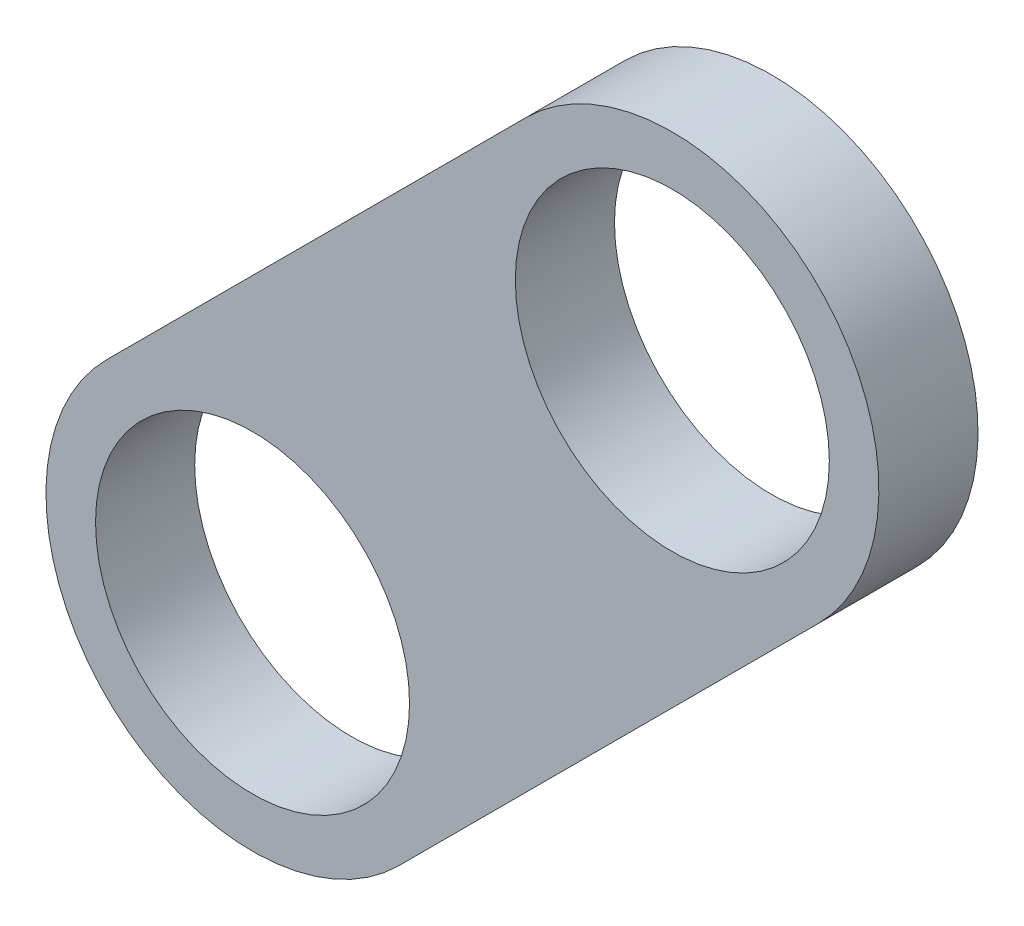
ISO-10303-21;
HEADER;
FILE_DESCRIPTION(('STEP AP214'),'2;1');
FILE_NAME('part.step','',(''),(''),'','','');
FILE_SCHEMA(('AUTOMOTIVE_DESIGN { 1 0 10303 214 1 1 1 1 }'));
ENDSEC;
DATA;
#1=APPLICATION_CONTEXT('core data for automotive mechanical design processes');
#2=APPLICATION_PROTOCOL_DEFINITION('international standard','automotive_design',2000,#1);
#3=PRODUCT_CONTEXT('',#1,'mechanical');
#4=PRODUCT('Part','Part','',(#3));
#5=PRODUCT_RELATED_PRODUCT_CATEGORY('part','',(#4));
#6=PRODUCT_DEFINITION_FORMATION('','',#4);
#7=PRODUCT_DEFINITION_CONTEXT('part definition',#1,'design');
#8=PRODUCT_DEFINITION('design','',#6,#7);
#9=PRODUCT_DEFINITION_SHAPE('','',#8);
#10=(LENGTH_UNIT() NAMED_UNIT(*) SI_UNIT(.MILLI.,.METRE.));
#11=(NAMED_UNIT(*) PLANE_ANGLE_UNIT() SI_UNIT($,.RADIAN.));
#12=(NAMED_UNIT(*) SI_UNIT($,.STERADIAN.) SOLID_ANGLE_UNIT());
#13=UNCERTAINTY_MEASURE_WITH_UNIT(LENGTH_MEASURE(1.E-05),#10,'distance_accuracy_value','');
#14=(GEOMETRIC_REPRESENTATION_CONTEXT(3) GLOBAL_UNCERTAINTY_ASSIGNED_CONTEXT((#13)) GLOBAL_UNIT_ASSIGNED_CONTEXT((#10,
#11,#12)) REPRESENTATION_CONTEXT('',''));
#15=CARTESIAN_POINT('',(0.,0.,0.));
#16=DIRECTION('',(0.,0.,1.));
#17=DIRECTION('',(1.,0.,0.));
#18=AXIS2_PLACEMENT_3D('',#15,#16,#17);
#19=CARTESIAN_POINT('',(0.,0.,6.));
#20=DIRECTION('',(0.,0.,1.));
#21=DIRECTION('',(1.,0.,0.));
#22=AXIS2_PLACEMENT_3D('',#19,#20,#21);
#23=PLANE('',#22);
#24=CARTESIAN_POINT('',(0.,0.,6.));
#25=DIRECTION('',(0.,0.,1.));
#26=DIRECTION('',(1.,0.,0.));
#27=AXIS2_PLACEMENT_3D('',#24,#25,#26);
#28=CIRCLE('',#27,9.5);
#29=CARTESIAN_POINT('',(9.5,0.,6.));
#30=VERTEX_POINT('',#29);
#31=EDGE_CURVE('E112',#30,#30,#28,.T.);
#32=ORIENTED_EDGE('',*,*,#31,.F.);
#33=EDGE_LOOP('',(#32));
#34=FACE_BOUND('',#33,.T.);
#35=CARTESIAN_POINT('',(0.,0.,6.));
#36=DIRECTION('',(0.,0.,1.));
#37=DIRECTION('',(1.,0.,0.));
#38=AXIS2_PLACEMENT_3D('',#35,#36,#37);
#39=CIRCLE('',#38,12.5);
#40=CARTESIAN_POINT('',(-8.83883476483185,8.83883476483185,6.));
#41=VERTEX_POINT('',#40);
#42=CARTESIAN_POINT('',(8.83883476483184,-8.83883476483184,6.));
#43=VERTEX_POINT('',#42);
#44=EDGE_CURVE('E92',#41,#43,#39,.T.);
#45=ORIENTED_EDGE('',*,*,#44,.T.);
#46=DIRECTION('',(0.707106781186548,0.707106781186548,0.));
#47=VECTOR('',#46,1.);
#48=CARTESIAN_POINT('',(8.83883476483184,-8.83883476483184,6.));
#49=LINE('',#48,#47);
#50=CARTESIAN_POINT('',(34.2388347648318,16.5611652351681,6.));
#51=VERTEX_POINT('',#50);
#52=EDGE_CURVE('E87',#43,#51,#49,.T.);
#53=ORIENTED_EDGE('',*,*,#52,.T.);
#54=CARTESIAN_POINT('',(25.4,25.4,6.));
#55=DIRECTION('',(0.,0.,1.));
#56=DIRECTION('',(1.,0.,0.));
#57=AXIS2_PLACEMENT_3D('',#54,#55,#56);
#58=CIRCLE('',#57,12.5);
#59=CARTESIAN_POINT('',(16.5611652351682,34.2388347648318,6.));
#60=VERTEX_POINT('',#59);
#61=EDGE_CURVE('E90',#51,#60,#58,.T.);
#62=ORIENTED_EDGE('',*,*,#61,.T.);
#63=DIRECTION('',(-0.707106781186548,-0.707106781186547,0.));
#64=VECTOR('',#63,1.);
#65=CARTESIAN_POINT('',(-8.83883476483185,8.83883476483185,6.));
#66=LINE('',#65,#64);
#67=EDGE_CURVE('E57',#60,#41,#66,.T.);
#68=ORIENTED_EDGE('',*,*,#67,.T.);
#69=EDGE_LOOP('',(#45,#53,#62,#68));
#70=FACE_BOUND('',#69,.T.);
#71=CARTESIAN_POINT('',(25.4,25.4,6.));
#72=DIRECTION('',(0.,0.,1.));
#73=DIRECTION('',(1.,0.,0.));
#74=AXIS2_PLACEMENT_3D('',#71,#72,#73);
#75=CIRCLE('',#74,9.5);
#76=CARTESIAN_POINT('',(34.9,25.4,6.));
#77=VERTEX_POINT('',#76);
#78=EDGE_CURVE('E134',#77,#77,#75,.T.);
#79=ORIENTED_EDGE('',*,*,#78,.F.);
#80=EDGE_LOOP('',(#79));
#81=FACE_BOUND('',#80,.T.);
#82=ADVANCED_FACE('F39',(#34,#70,#81),#23,.T.);
#83=CARTESIAN_POINT('',(0.,0.,0.));
#84=DIRECTION('',(0.,0.,1.));
#85=DIRECTION('',(1.,0.,0.));
#86=AXIS2_PLACEMENT_3D('',#83,#84,#85);
#87=PLANE('',#86);
#88=CARTESIAN_POINT('',(0.,0.,0.));
#89=DIRECTION('',(0.,0.,1.));
#90=DIRECTION('',(1.,0.,0.));
#91=AXIS2_PLACEMENT_3D('',#88,#89,#90);
#92=CIRCLE('',#91,12.5);
#93=CARTESIAN_POINT('',(-8.83883476483185,8.83883476483185,0.));
#94=VERTEX_POINT('',#93);
#95=CARTESIAN_POINT('',(8.83883476483184,-8.83883476483184,0.));
#96=VERTEX_POINT('',#95);
#97=EDGE_CURVE('E108',#94,#96,#92,.T.);
#98=ORIENTED_EDGE('',*,*,#97,.F.);
#99=DIRECTION('',(-0.707106781186548,-0.707106781186547,0.));
#100=VECTOR('',#99,1.);
#101=CARTESIAN_POINT('',(-8.83883476483185,8.83883476483185,0.));
#102=LINE('',#101,#100);
#103=CARTESIAN_POINT('',(16.5611652351682,34.2388347648318,0.));
#104=VERTEX_POINT('',#103);
#105=EDGE_CURVE('E80',#104,#94,#102,.T.);
#106=ORIENTED_EDGE('',*,*,#105,.F.);
#107=CARTESIAN_POINT('',(25.4,25.4,0.));
#108=DIRECTION('',(0.,0.,1.));
#109=DIRECTION('',(1.,0.,0.));
#110=AXIS2_PLACEMENT_3D('',#107,#108,#109);
#111=CIRCLE('',#110,12.5);
#112=CARTESIAN_POINT('',(34.2388347648318,16.5611652351681,0.));
#113=VERTEX_POINT('',#112);
#114=EDGE_CURVE('E74',#113,#104,#111,.T.);
#115=ORIENTED_EDGE('',*,*,#114,.F.);
#116=DIRECTION('',(0.707106781186548,0.707106781186548,0.));
#117=VECTOR('',#116,1.);
#118=CARTESIAN_POINT('',(8.83883476483184,-8.83883476483184,0.));
#119=LINE('',#118,#117);
#120=EDGE_CURVE('E97',#96,#113,#119,.T.);
#121=ORIENTED_EDGE('',*,*,#120,.F.);
#122=EDGE_LOOP('',(#98,#106,#115,#121));
#123=FACE_BOUND('',#122,.T.);
#124=CARTESIAN_POINT('',(0.,0.,0.));
#125=DIRECTION('',(0.,0.,1.));
#126=DIRECTION('',(1.,0.,0.));
#127=AXIS2_PLACEMENT_3D('',#124,#125,#126);
#128=CIRCLE('',#127,9.5);
#129=CARTESIAN_POINT('',(9.5,0.,0.));
#130=VERTEX_POINT('',#129);
#131=EDGE_CURVE('E130',#130,#130,#128,.T.);
#132=ORIENTED_EDGE('',*,*,#131,.T.);
#133=EDGE_LOOP('',(#132));
#134=FACE_BOUND('',#133,.T.);
#135=CARTESIAN_POINT('',(25.4,25.4,0.));
#136=DIRECTION('',(0.,0.,1.));
#137=DIRECTION('',(1.,0.,0.));
#138=AXIS2_PLACEMENT_3D('',#135,#136,#137);
#139=CIRCLE('',#138,9.5);
#140=CARTESIAN_POINT('',(34.9,25.4,0.));
#141=VERTEX_POINT('',#140);
#142=EDGE_CURVE('E138',#141,#141,#139,.T.);
#143=ORIENTED_EDGE('',*,*,#142,.T.);
#144=EDGE_LOOP('',(#143));
#145=FACE_BOUND('',#144,.T.);
#146=ADVANCED_FACE('F125',(#123,#134,#145),#87,.F.);
#147=CARTESIAN_POINT('',(0.,0.,6.));
#148=DIRECTION('',(0.,0.,-1.));
#149=DIRECTION('',(-1.,0.,0.));
#150=AXIS2_PLACEMENT_3D('',#147,#148,#149);
#151=CYLINDRICAL_SURFACE('',#150,12.5);
#152=ORIENTED_EDGE('',*,*,#97,.T.);
#153=DIRECTION('',(0.,0.,-1.));
#154=VECTOR('',#153,1.);
#155=CARTESIAN_POINT('',(8.83883476483184,-8.83883476483184,6.));
#156=LINE('',#155,#154);
#157=EDGE_CURVE('E11',#43,#96,#156,.T.);
#158=ORIENTED_EDGE('',*,*,#157,.F.);
#159=ORIENTED_EDGE('',*,*,#44,.F.);
#160=DIRECTION('',(0.,0.,-1.));
#161=VECTOR('',#160,1.);
#162=CARTESIAN_POINT('',(-8.83883476483185,8.83883476483185,6.));
#163=LINE('',#162,#161);
#164=EDGE_CURVE('E104',#41,#94,#163,.T.);
#165=ORIENTED_EDGE('',*,*,#164,.T.);
#166=EDGE_LOOP('',(#152,#158,#159,#165));
#167=FACE_BOUND('',#166,.T.);
#168=ADVANCED_FACE('F41',(#167),#151,.T.);
#169=CARTESIAN_POINT('',(8.83883476483184,-8.83883476483184,6.));
#170=DIRECTION('',(-0.707106781186547,0.707106781186547,0.));
#171=DIRECTION('',(-0.707106781186548,-0.707106781186548,0.));
#172=AXIS2_PLACEMENT_3D('',#169,#170,#171);
#173=PLANE('',#172);
#174=ORIENTED_EDGE('',*,*,#120,.T.);
#175=DIRECTION('',(0.,0.,-1.));
#176=VECTOR('',#175,1.);
#177=CARTESIAN_POINT('',(34.2388347648318,16.5611652351681,6.));
#178=LINE('',#177,#176);
#179=EDGE_CURVE('E49',#51,#113,#178,.T.);
#180=ORIENTED_EDGE('',*,*,#179,.F.);
#181=ORIENTED_EDGE('',*,*,#52,.F.);
#182=ORIENTED_EDGE('',*,*,#157,.T.);
#183=EDGE_LOOP('',(#174,#180,#181,#182));
#184=FACE_BOUND('',#183,.T.);
#185=ADVANCED_FACE('F96',(#184),#173,.F.);
#186=CARTESIAN_POINT('',(25.4,25.4,6.));
#187=DIRECTION('',(0.,0.,-1.));
#188=DIRECTION('',(-1.,0.,0.));
#189=AXIS2_PLACEMENT_3D('',#186,#187,#188);
#190=CYLINDRICAL_SURFACE('',#189,12.5);
#191=ORIENTED_EDGE('',*,*,#114,.T.);
#192=DIRECTION('',(0.,0.,-1.));
#193=VECTOR('',#192,1.);
#194=CARTESIAN_POINT('',(16.5611652351682,34.2388347648318,6.));
#195=LINE('',#194,#193);
#196=EDGE_CURVE('E99',#60,#104,#195,.T.);
#197=ORIENTED_EDGE('',*,*,#196,.F.);
#198=ORIENTED_EDGE('',*,*,#61,.F.);
#199=ORIENTED_EDGE('',*,*,#179,.T.);
#200=EDGE_LOOP('',(#191,#197,#198,#199));
#201=FACE_BOUND('',#200,.T.);
#202=ADVANCED_FACE('F100',(#201),#190,.T.);
#203=CARTESIAN_POINT('',(-8.83883476483185,8.83883476483185,6.));
#204=DIRECTION('',(0.707106781186547,-0.707106781186548,0.));
#205=DIRECTION('',(0.707106781186548,0.707106781186547,0.));
#206=AXIS2_PLACEMENT_3D('',#203,#204,#205);
#207=PLANE('',#206);
#208=ORIENTED_EDGE('',*,*,#105,.T.);
#209=ORIENTED_EDGE('',*,*,#164,.F.);
#210=ORIENTED_EDGE('',*,*,#67,.F.);
#211=ORIENTED_EDGE('',*,*,#196,.T.);
#212=EDGE_LOOP('',(#208,#209,#210,#211));
#213=FACE_BOUND('',#212,.T.);
#214=ADVANCED_FACE('F122',(#213),#207,.F.);
#215=CARTESIAN_POINT('',(0.,0.,6.));
#216=DIRECTION('',(0.,0.,-1.));
#217=DIRECTION('',(-1.,0.,0.));
#218=AXIS2_PLACEMENT_3D('',#215,#216,#217);
#219=CYLINDRICAL_SURFACE('',#218,9.5);
#220=ORIENTED_EDGE('',*,*,#31,.T.);
#221=EDGE_LOOP('',(#220));
#222=FACE_BOUND('',#221,.T.);
#223=ORIENTED_EDGE('',*,*,#131,.F.);
#224=EDGE_LOOP('',(#223));
#225=FACE_BOUND('',#224,.T.);
#226=ADVANCED_FACE('F157',(#222,#225),#219,.F.);
#227=CARTESIAN_POINT('',(25.4,25.4,6.));
#228=DIRECTION('',(0.,0.,-1.));
#229=DIRECTION('',(-1.,0.,0.));
#230=AXIS2_PLACEMENT_3D('',#227,#228,#229);
#231=CYLINDRICAL_SURFACE('',#230,9.5);
#232=ORIENTED_EDGE('',*,*,#78,.T.);
#233=EDGE_LOOP('',(#232));
#234=FACE_BOUND('',#233,.T.);
#235=ORIENTED_EDGE('',*,*,#142,.F.);
#236=EDGE_LOOP('',(#235));
#237=FACE_BOUND('',#236,.T.);
#238=ADVANCED_FACE('F146',(#234,#237),#231,.F.);
#239=CLOSED_SHELL('',(#82,#146,#168,#185,#202,#214,#226,#238));
#240=MANIFOLD_SOLID_BREP('B2',#239);
#241=ADVANCED_BREP_SHAPE_REPRESENTATION('',(#18,#240),#14);
#242=SHAPE_DEFINITION_REPRESENTATION(#9,#241);
ENDSEC;
END-ISO-10303-21;
